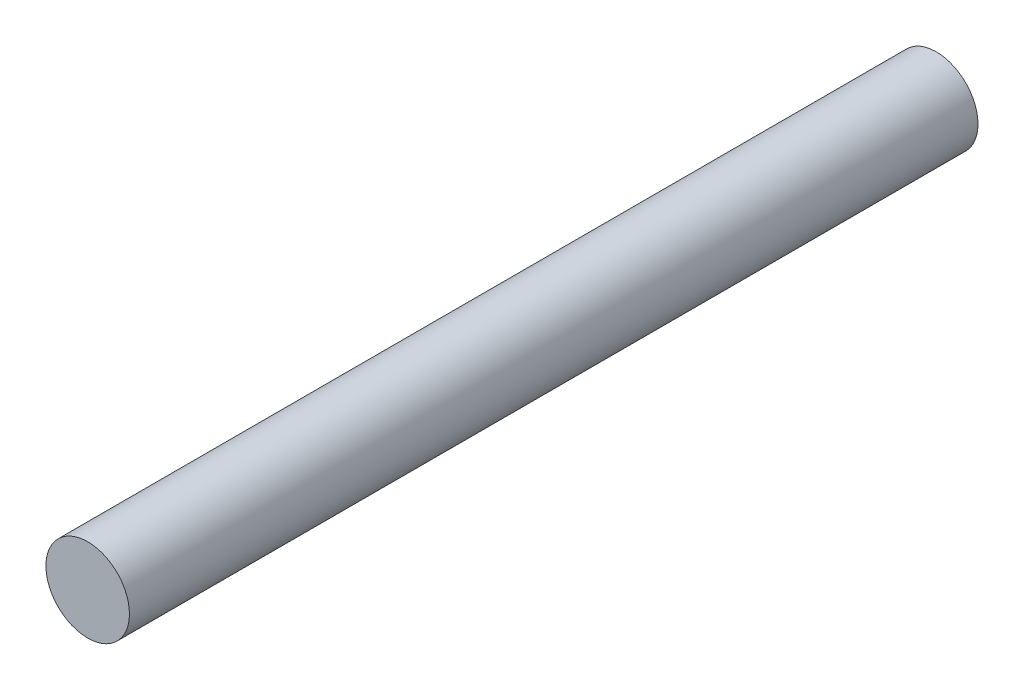
ISO-10303-21;
HEADER;
FILE_DESCRIPTION(('STEP AP214'),'2;1');
FILE_NAME('part.step','',(''),(''),'','','');
FILE_SCHEMA(('AUTOMOTIVE_DESIGN { 1 0 10303 214 1 1 1 1 }'));
ENDSEC;
DATA;
#1=APPLICATION_CONTEXT('core data for automotive mechanical design processes');
#2=APPLICATION_PROTOCOL_DEFINITION('international standard','automotive_design',2000,#1);
#3=PRODUCT_CONTEXT('',#1,'mechanical');
#4=PRODUCT('Part','Part','',(#3));
#5=PRODUCT_RELATED_PRODUCT_CATEGORY('part','',(#4));
#6=PRODUCT_DEFINITION_FORMATION('','',#4);
#7=PRODUCT_DEFINITION_CONTEXT('part definition',#1,'design');
#8=PRODUCT_DEFINITION('design','',#6,#7);
#9=PRODUCT_DEFINITION_SHAPE('','',#8);
#10=(LENGTH_UNIT() NAMED_UNIT(*) SI_UNIT(.MILLI.,.METRE.));
#11=(NAMED_UNIT(*) PLANE_ANGLE_UNIT() SI_UNIT($,.RADIAN.));
#12=(NAMED_UNIT(*) SI_UNIT($,.STERADIAN.) SOLID_ANGLE_UNIT());
#13=UNCERTAINTY_MEASURE_WITH_UNIT(LENGTH_MEASURE(1.E-05),#10,'distance_accuracy_value','');
#14=(GEOMETRIC_REPRESENTATION_CONTEXT(3) GLOBAL_UNCERTAINTY_ASSIGNED_CONTEXT((#13)) GLOBAL_UNIT_ASSIGNED_CONTEXT((#10,
#11,#12)) REPRESENTATION_CONTEXT('',''));
#15=CARTESIAN_POINT('',(0.,0.,0.));
#16=DIRECTION('',(0.,0.,1.));
#17=DIRECTION('',(1.,0.,0.));
#18=AXIS2_PLACEMENT_3D('',#15,#16,#17);
#19=CARTESIAN_POINT('',(0.,0.,25.4));
#20=DIRECTION('',(0.,0.,-1.));
#21=DIRECTION('',(-1.,0.,0.));
#22=AXIS2_PLACEMENT_3D('',#19,#20,#21);
#23=CYLINDRICAL_SURFACE('',#22,1.25);
#24=CARTESIAN_POINT('',(0.,0.,25.4));
#25=DIRECTION('',(0.,0.,1.));
#26=DIRECTION('',(1.,0.,0.));
#27=AXIS2_PLACEMENT_3D('',#24,#25,#26);
#28=CIRCLE('',#27,1.25);
#29=CARTESIAN_POINT('',(1.25,0.,25.4));
#30=VERTEX_POINT('',#29);
#31=EDGE_CURVE('E10',#30,#30,#28,.T.);
#32=ORIENTED_EDGE('',*,*,#31,.F.);
#33=EDGE_LOOP('',(#32));
#34=FACE_BOUND('',#33,.T.);
#35=CARTESIAN_POINT('',(0.,0.,0.));
#36=DIRECTION('',(0.,0.,1.));
#37=DIRECTION('',(1.,0.,0.));
#38=AXIS2_PLACEMENT_3D('',#35,#36,#37);
#39=CIRCLE('',#38,1.25);
#40=CARTESIAN_POINT('',(1.25,0.,0.));
#41=VERTEX_POINT('',#40);
#42=EDGE_CURVE('E36',#41,#41,#39,.T.);
#43=ORIENTED_EDGE('',*,*,#42,.T.);
#44=EDGE_LOOP('',(#43));
#45=FACE_BOUND('',#44,.T.);
#46=ADVANCED_FACE('F33',(#34,#45),#23,.T.);
#47=CARTESIAN_POINT('',(0.,0.,25.4));
#48=DIRECTION('',(0.,0.,1.));
#49=DIRECTION('',(1.,0.,0.));
#50=AXIS2_PLACEMENT_3D('',#47,#48,#49);
#51=PLANE('',#50);
#52=ORIENTED_EDGE('',*,*,#31,.T.);
#53=EDGE_LOOP('',(#52));
#54=FACE_BOUND('',#53,.T.);
#55=ADVANCED_FACE('F48',(#54),#51,.T.);
#56=CARTESIAN_POINT('',(0.,0.,0.));
#57=DIRECTION('',(0.,0.,1.));
#58=DIRECTION('',(1.,0.,0.));
#59=AXIS2_PLACEMENT_3D('',#56,#57,#58);
#60=PLANE('',#59);
#61=ORIENTED_EDGE('',*,*,#42,.F.);
#62=EDGE_LOOP('',(#61));
#63=FACE_BOUND('',#62,.T.);
#64=ADVANCED_FACE('F46',(#63),#60,.F.);
#65=CLOSED_SHELL('',(#46,#55,#64));
#66=MANIFOLD_SOLID_BREP('B2',#65);
#67=ADVANCED_BREP_SHAPE_REPRESENTATION('',(#18,#66),#14);
#68=SHAPE_DEFINITION_REPRESENTATION(#9,#67);
ENDSEC;
END-ISO-10303-21;
